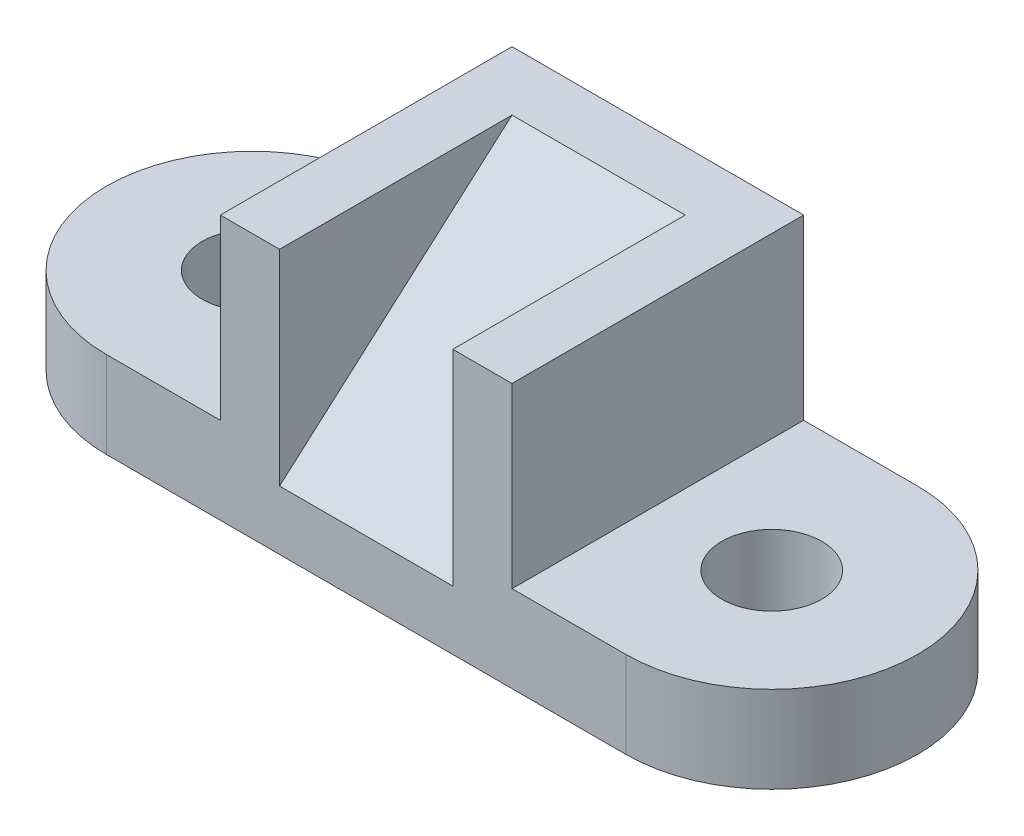
ISO-10303-21;
HEADER;
FILE_DESCRIPTION(('STEP AP214'),'2;1');
FILE_NAME('part.step','',(''),(''),'','','');
FILE_SCHEMA(('AUTOMOTIVE_DESIGN { 1 0 10303 214 1 1 1 1 }'));
ENDSEC;
DATA;
#1=APPLICATION_CONTEXT('core data for automotive mechanical design processes');
#2=APPLICATION_PROTOCOL_DEFINITION('international standard','automotive_design',2000,#1);
#3=PRODUCT_CONTEXT('',#1,'mechanical');
#4=PRODUCT('Part','Part','',(#3));
#5=PRODUCT_RELATED_PRODUCT_CATEGORY('part','',(#4));
#6=PRODUCT_DEFINITION_FORMATION('','',#4);
#7=PRODUCT_DEFINITION_CONTEXT('part definition',#1,'design');
#8=PRODUCT_DEFINITION('design','',#6,#7);
#9=PRODUCT_DEFINITION_SHAPE('','',#8);
#10=(LENGTH_UNIT() NAMED_UNIT(*) SI_UNIT(.MILLI.,.METRE.));
#11=(NAMED_UNIT(*) PLANE_ANGLE_UNIT() SI_UNIT($,.RADIAN.));
#12=(NAMED_UNIT(*) SI_UNIT($,.STERADIAN.) SOLID_ANGLE_UNIT());
#13=UNCERTAINTY_MEASURE_WITH_UNIT(LENGTH_MEASURE(1.E-05),#10,'distance_accuracy_value','');
#14=(GEOMETRIC_REPRESENTATION_CONTEXT(3) GLOBAL_UNCERTAINTY_ASSIGNED_CONTEXT((#13)) GLOBAL_UNIT_ASSIGNED_CONTEXT((#10,
#11,#12)) REPRESENTATION_CONTEXT('',''));
#15=CARTESIAN_POINT('',(0.,0.,0.));
#16=DIRECTION('',(0.,0.,1.));
#17=DIRECTION('',(1.,0.,0.));
#18=AXIS2_PLACEMENT_3D('',#15,#16,#17);
#19=CARTESIAN_POINT('',(0.,19.,0.));
#20=DIRECTION('',(0.,1.,0.));
#21=DIRECTION('',(0.,0.,1.));
#22=AXIS2_PLACEMENT_3D('',#19,#20,#21);
#23=PLANE('',#22);
#24=CARTESIAN_POINT('',(57.,19.,0.));
#25=DIRECTION('',(0.,1.,0.));
#26=DIRECTION('',(0.,0.,1.));
#27=AXIS2_PLACEMENT_3D('',#24,#25,#26);
#28=CIRCLE('',#27,11.);
#29=CARTESIAN_POINT('',(57.,19.,-11.));
#30=VERTEX_POINT('',#29);
#31=EDGE_CURVE('E150',#30,#30,#28,.F.);
#32=ORIENTED_EDGE('',*,*,#31,.T.);
#33=EDGE_LOOP('',(#32));
#34=FACE_BOUND('',#33,.T.);
#35=DIRECTION('',(-1.,0.,0.));
#36=VECTOR('',#35,1.);
#37=CARTESIAN_POINT('',(0.,19.,-32.));
#38=LINE('',#37,#36);
#39=CARTESIAN_POINT('',(57.,19.,-32.));
#40=VERTEX_POINT('',#39);
#41=CARTESIAN_POINT('',(32.,19.,-32.));
#42=VERTEX_POINT('',#41);
#43=EDGE_CURVE('E163',#40,#42,#38,.T.);
#44=ORIENTED_EDGE('',*,*,#43,.T.);
#45=DIRECTION('',(0.,0.,-1.));
#46=VECTOR('',#45,1.);
#47=CARTESIAN_POINT('',(32.,19.,-32.));
#48=LINE('',#47,#46);
#49=CARTESIAN_POINT('',(32.,19.,32.));
#50=VERTEX_POINT('',#49);
#51=EDGE_CURVE('E221',#50,#42,#48,.T.);
#52=ORIENTED_EDGE('',*,*,#51,.F.);
#53=DIRECTION('',(1.,0.,0.));
#54=VECTOR('',#53,1.);
#55=CARTESIAN_POINT('',(0.,19.,32.));
#56=LINE('',#55,#54);
#57=CARTESIAN_POINT('',(57.,19.,32.));
#58=VERTEX_POINT('',#57);
#59=EDGE_CURVE('E146',#50,#58,#56,.T.);
#60=ORIENTED_EDGE('',*,*,#59,.T.);
#61=CARTESIAN_POINT('',(57.,19.,0.));
#62=DIRECTION('',(0.,1.,0.));
#63=DIRECTION('',(0.,0.,1.));
#64=AXIS2_PLACEMENT_3D('',#61,#62,#63);
#65=CIRCLE('',#64,32.);
#66=EDGE_CURVE('E159',#58,#40,#65,.T.);
#67=ORIENTED_EDGE('',*,*,#66,.T.);
#68=EDGE_LOOP('',(#44,#52,#60,#67));
#69=FACE_BOUND('',#68,.T.);
#70=ADVANCED_FACE('F39',(#34,#69),#23,.T.);
#71=CARTESIAN_POINT('',(-57.,19.,0.));
#72=DIRECTION('',(0.,1.,0.));
#73=DIRECTION('',(0.,0.,1.));
#74=AXIS2_PLACEMENT_3D('',#71,#72,#73);
#75=CIRCLE('',#74,11.);
#76=CARTESIAN_POINT('',(-57.,19.,-11.));
#77=VERTEX_POINT('',#76);
#78=EDGE_CURVE('E147',#77,#77,#75,.F.);
#79=ORIENTED_EDGE('',*,*,#78,.T.);
#80=EDGE_LOOP('',(#79));
#81=FACE_BOUND('',#80,.T.);
#82=DIRECTION('',(1.,0.,0.));
#83=VECTOR('',#82,1.);
#84=CARTESIAN_POINT('',(0.,19.,32.));
#85=LINE('',#84,#83);
#86=CARTESIAN_POINT('',(-57.,19.,32.));
#87=VERTEX_POINT('',#86);
#88=CARTESIAN_POINT('',(-32.,19.,32.));
#89=VERTEX_POINT('',#88);
#90=EDGE_CURVE('E54',#87,#89,#85,.T.);
#91=ORIENTED_EDGE('',*,*,#90,.T.);
#92=DIRECTION('',(0.,0.,1.));
#93=VECTOR('',#92,1.);
#94=CARTESIAN_POINT('',(-32.,19.,-32.));
#95=LINE('',#94,#93);
#96=CARTESIAN_POINT('',(-32.,19.,-32.));
#97=VERTEX_POINT('',#96);
#98=EDGE_CURVE('E58',#97,#89,#95,.T.);
#99=ORIENTED_EDGE('',*,*,#98,.F.);
#100=CARTESIAN_POINT('',(-57.,19.,-32.));
#101=VERTEX_POINT('',#100);
#102=EDGE_CURVE('E162',#97,#101,#38,.T.);
#103=ORIENTED_EDGE('',*,*,#102,.T.);
#104=CARTESIAN_POINT('',(-57.,19.,0.));
#105=DIRECTION('',(0.,1.,0.));
#106=DIRECTION('',(0.,0.,1.));
#107=AXIS2_PLACEMENT_3D('',#104,#105,#106);
#108=CIRCLE('',#107,32.);
#109=EDGE_CURVE('E165',#101,#87,#108,.T.);
#110=ORIENTED_EDGE('',*,*,#109,.T.);
#111=EDGE_LOOP('',(#91,#99,#103,#110));
#112=FACE_BOUND('',#111,.T.);
#113=ADVANCED_FACE('F235',(#81,#112),#23,.T.);
#114=CARTESIAN_POINT('',(-57.,13.,32.));
#115=DIRECTION('',(0.,0.,-1.));
#116=DIRECTION('',(-1.,0.,0.));
#117=AXIS2_PLACEMENT_3D('',#114,#115,#116);
#118=PLANE('',#117);
#119=DIRECTION('',(1.,0.,0.));
#120=VECTOR('',#119,1.);
#121=CARTESIAN_POINT('',(-313.810533540325,13.,32.));
#122=LINE('',#121,#120);
#123=CARTESIAN_POINT('',(-19.,13.,32.));
#124=VERTEX_POINT('',#123);
#125=CARTESIAN_POINT('',(19.,13.,32.));
#126=VERTEX_POINT('',#125);
#127=EDGE_CURVE('E173',#124,#126,#122,.T.);
#128=ORIENTED_EDGE('',*,*,#127,.F.);
#129=DIRECTION('',(0.,-1.,0.));
#130=VECTOR('',#129,1.);
#131=CARTESIAN_POINT('',(-19.,19.,32.));
#132=LINE('',#131,#130);
#133=CARTESIAN_POINT('',(-19.,58.,32.));
#134=VERTEX_POINT('',#133);
#135=EDGE_CURVE('E168',#134,#124,#132,.T.);
#136=ORIENTED_EDGE('',*,*,#135,.F.);
#137=DIRECTION('',(1.,0.,0.));
#138=VECTOR('',#137,1.);
#139=CARTESIAN_POINT('',(-32.,58.,32.));
#140=LINE('',#139,#138);
#141=CARTESIAN_POINT('',(-32.,58.,32.));
#142=VERTEX_POINT('',#141);
#143=EDGE_CURVE('E443',#142,#134,#140,.T.);
#144=ORIENTED_EDGE('',*,*,#143,.F.);
#145=DIRECTION('',(0.,-1.,0.));
#146=VECTOR('',#145,1.);
#147=CARTESIAN_POINT('',(-32.,58.,32.));
#148=LINE('',#147,#146);
#149=EDGE_CURVE('E227',#142,#89,#148,.T.);
#150=ORIENTED_EDGE('',*,*,#149,.T.);
#151=ORIENTED_EDGE('',*,*,#90,.F.);
#152=DIRECTION('',(0.,-1.,0.));
#153=VECTOR('',#152,1.);
#154=CARTESIAN_POINT('',(-57.,13.,32.));
#155=LINE('',#154,#153);
#156=CARTESIAN_POINT('',(-57.,0.,32.));
#157=VERTEX_POINT('',#156);
#158=EDGE_CURVE('E47',#87,#157,#155,.T.);
#159=ORIENTED_EDGE('',*,*,#158,.T.);
#160=DIRECTION('',(1.,0.,0.));
#161=VECTOR('',#160,1.);
#162=CARTESIAN_POINT('',(-57.,0.,32.));
#163=LINE('',#162,#161);
#164=CARTESIAN_POINT('',(57.,0.,32.));
#165=VERTEX_POINT('',#164);
#166=EDGE_CURVE('E189',#157,#165,#163,.T.);
#167=ORIENTED_EDGE('',*,*,#166,.T.);
#168=DIRECTION('',(0.,-1.,0.));
#169=VECTOR('',#168,1.);
#170=CARTESIAN_POINT('',(57.,13.,32.));
#171=LINE('',#170,#169);
#172=EDGE_CURVE('E201',#58,#165,#171,.T.);
#173=ORIENTED_EDGE('',*,*,#172,.F.);
#174=ORIENTED_EDGE('',*,*,#59,.F.);
#175=DIRECTION('',(0.,-1.,0.));
#176=VECTOR('',#175,1.);
#177=CARTESIAN_POINT('',(32.,58.,32.));
#178=LINE('',#177,#176);
#179=CARTESIAN_POINT('',(32.,58.,32.));
#180=VERTEX_POINT('',#179);
#181=EDGE_CURVE('E125',#180,#50,#178,.T.);
#182=ORIENTED_EDGE('',*,*,#181,.F.);
#183=DIRECTION('',(1.,0.,0.));
#184=VECTOR('',#183,1.);
#185=CARTESIAN_POINT('',(19.,58.,32.));
#186=LINE('',#185,#184);
#187=CARTESIAN_POINT('',(19.,58.,32.));
#188=VERTEX_POINT('',#187);
#189=EDGE_CURVE('E131',#188,#180,#186,.T.);
#190=ORIENTED_EDGE('',*,*,#189,.F.);
#191=DIRECTION('',(0.,-1.,0.));
#192=VECTOR('',#191,1.);
#193=CARTESIAN_POINT('',(19.,19.,32.));
#194=LINE('',#193,#192);
#195=EDGE_CURVE('E171',#188,#126,#194,.T.);
#196=ORIENTED_EDGE('',*,*,#195,.T.);
#197=EDGE_LOOP('',(#128,#136,#144,#150,#151,#159,#167,#173,#174,#182,#190,#196));
#198=FACE_BOUND('',#197,.T.);
#199=ADVANCED_FACE('F144',(#198),#118,.F.);
#200=CARTESIAN_POINT('',(-57.,0.,0.));
#201=DIRECTION('',(0.,1.,0.));
#202=DIRECTION('',(0.,0.,1.));
#203=AXIS2_PLACEMENT_3D('',#200,#201,#202);
#204=PLANE('',#203);
#205=CARTESIAN_POINT('',(-57.,0.,0.));
#206=DIRECTION('',(0.,1.,0.));
#207=DIRECTION('',(0.,0.,1.));
#208=AXIS2_PLACEMENT_3D('',#205,#206,#207);
#209=CIRCLE('',#208,32.);
#210=CARTESIAN_POINT('',(-57.,0.,-32.));
#211=VERTEX_POINT('',#210);
#212=EDGE_CURVE('E186',#211,#157,#209,.T.);
#213=ORIENTED_EDGE('',*,*,#212,.F.);
#214=DIRECTION('',(-1.,0.,0.));
#215=VECTOR('',#214,1.);
#216=CARTESIAN_POINT('',(-57.,0.,-32.));
#217=LINE('',#216,#215);
#218=CARTESIAN_POINT('',(57.,0.,-32.));
#219=VERTEX_POINT('',#218);
#220=EDGE_CURVE('E193',#219,#211,#217,.T.);
#221=ORIENTED_EDGE('',*,*,#220,.F.);
#222=CARTESIAN_POINT('',(57.,0.,0.));
#223=DIRECTION('',(0.,1.,0.));
#224=DIRECTION('',(0.,0.,1.));
#225=AXIS2_PLACEMENT_3D('',#222,#223,#224);
#226=CIRCLE('',#225,32.);
#227=EDGE_CURVE('E191',#165,#219,#226,.T.);
#228=ORIENTED_EDGE('',*,*,#227,.F.);
#229=ORIENTED_EDGE('',*,*,#166,.F.);
#230=EDGE_LOOP('',(#213,#221,#228,#229));
#231=FACE_BOUND('',#230,.T.);
#232=CARTESIAN_POINT('',(-57.,0.,0.));
#233=DIRECTION('',(0.,1.,0.));
#234=DIRECTION('',(0.,0.,1.));
#235=AXIS2_PLACEMENT_3D('',#232,#233,#234);
#236=CIRCLE('',#235,11.);
#237=CARTESIAN_POINT('',(-57.,0.,-11.));
#238=VERTEX_POINT('',#237);
#239=EDGE_CURVE('E183',#238,#238,#236,.T.);
#240=ORIENTED_EDGE('',*,*,#239,.T.);
#241=EDGE_LOOP('',(#240));
#242=FACE_BOUND('',#241,.T.);
#243=CARTESIAN_POINT('',(57.,0.,0.));
#244=DIRECTION('',(0.,1.,0.));
#245=DIRECTION('',(0.,0.,1.));
#246=AXIS2_PLACEMENT_3D('',#243,#244,#245);
#247=CIRCLE('',#246,11.);
#248=CARTESIAN_POINT('',(57.,0.,-11.));
#249=VERTEX_POINT('',#248);
#250=EDGE_CURVE('E180',#249,#249,#247,.T.);
#251=ORIENTED_EDGE('',*,*,#250,.T.);
#252=EDGE_LOOP('',(#251));
#253=FACE_BOUND('',#252,.T.);
#254=ADVANCED_FACE('F211',(#231,#242,#253),#204,.F.);
#255=CARTESIAN_POINT('',(-57.,13.,0.));
#256=DIRECTION('',(0.,-1.,0.));
#257=DIRECTION('',(0.,0.,-1.));
#258=AXIS2_PLACEMENT_3D('',#255,#256,#257);
#259=CYLINDRICAL_SURFACE('',#258,32.);
#260=ORIENTED_EDGE('',*,*,#212,.T.);
#261=ORIENTED_EDGE('',*,*,#158,.F.);
#262=ORIENTED_EDGE('',*,*,#109,.F.);
#263=DIRECTION('',(0.,-1.,0.));
#264=VECTOR('',#263,1.);
#265=CARTESIAN_POINT('',(-57.,13.,-32.));
#266=LINE('',#265,#264);
#267=EDGE_CURVE('E195',#101,#211,#266,.T.);
#268=ORIENTED_EDGE('',*,*,#267,.T.);
#269=EDGE_LOOP('',(#260,#261,#262,#268));
#270=FACE_BOUND('',#269,.T.);
#271=ADVANCED_FACE('F41',(#270),#259,.T.);
#272=CARTESIAN_POINT('',(57.,13.,0.));
#273=DIRECTION('',(0.,-1.,0.));
#274=DIRECTION('',(0.,0.,-1.));
#275=AXIS2_PLACEMENT_3D('',#272,#273,#274);
#276=CYLINDRICAL_SURFACE('',#275,32.);
#277=ORIENTED_EDGE('',*,*,#227,.T.);
#278=DIRECTION('',(0.,-1.,0.));
#279=VECTOR('',#278,1.);
#280=CARTESIAN_POINT('',(57.,13.,-32.));
#281=LINE('',#280,#279);
#282=EDGE_CURVE('E198',#40,#219,#281,.T.);
#283=ORIENTED_EDGE('',*,*,#282,.F.);
#284=ORIENTED_EDGE('',*,*,#66,.F.);
#285=ORIENTED_EDGE('',*,*,#172,.T.);
#286=EDGE_LOOP('',(#277,#283,#284,#285));
#287=FACE_BOUND('',#286,.T.);
#288=ADVANCED_FACE('F215',(#287),#276,.T.);
#289=CARTESIAN_POINT('',(-57.,13.,-32.));
#290=DIRECTION('',(0.,0.,1.));
#291=DIRECTION('',(1.,0.,0.));
#292=AXIS2_PLACEMENT_3D('',#289,#290,#291);
#293=PLANE('',#292);
#294=ORIENTED_EDGE('',*,*,#220,.T.);
#295=ORIENTED_EDGE('',*,*,#267,.F.);
#296=ORIENTED_EDGE('',*,*,#102,.F.);
#297=DIRECTION('',(0.,-1.,0.));
#298=VECTOR('',#297,1.);
#299=CARTESIAN_POINT('',(-32.,58.,-32.));
#300=LINE('',#299,#298);
#301=CARTESIAN_POINT('',(-32.,58.,-32.));
#302=VERTEX_POINT('',#301);
#303=EDGE_CURVE('E152',#302,#97,#300,.T.);
#304=ORIENTED_EDGE('',*,*,#303,.F.);
#305=DIRECTION('',(-1.,0.,0.));
#306=VECTOR('',#305,1.);
#307=CARTESIAN_POINT('',(-32.,58.,-32.));
#308=LINE('',#307,#306);
#309=CARTESIAN_POINT('',(32.,58.,-32.));
#310=VERTEX_POINT('',#309);
#311=EDGE_CURVE('E130',#310,#302,#308,.T.);
#312=ORIENTED_EDGE('',*,*,#311,.F.);
#313=DIRECTION('',(0.,-1.,0.));
#314=VECTOR('',#313,1.);
#315=CARTESIAN_POINT('',(32.,58.,-32.));
#316=LINE('',#315,#314);
#317=EDGE_CURVE('E127',#310,#42,#316,.T.);
#318=ORIENTED_EDGE('',*,*,#317,.T.);
#319=ORIENTED_EDGE('',*,*,#43,.F.);
#320=ORIENTED_EDGE('',*,*,#282,.T.);
#321=EDGE_LOOP('',(#294,#295,#296,#304,#312,#318,#319,#320));
#322=FACE_BOUND('',#321,.T.);
#323=ADVANCED_FACE('F219',(#322),#293,.F.);
#324=CARTESIAN_POINT('',(-57.,13.,0.));
#325=DIRECTION('',(0.,-1.,0.));
#326=DIRECTION('',(0.,0.,-1.));
#327=AXIS2_PLACEMENT_3D('',#324,#325,#326);
#328=CYLINDRICAL_SURFACE('',#327,11.);
#329=CARTESIAN_POINT('',(-57.,0.,-11.));
#330=CARTESIAN_POINT('',(-57.,0.197916666666667,-11.));
#331=CARTESIAN_POINT('',(-57.,0.395833333333334,-11.));
#332=CARTESIAN_POINT('',(-57.,0.791666666666667,-11.));
#333=CARTESIAN_POINT('',(-57.,0.989583333333334,-11.));
#334=CARTESIAN_POINT('',(-57.,1.38541666666667,-11.));
#335=CARTESIAN_POINT('',(-57.,1.58333333333333,-11.));
#336=CARTESIAN_POINT('',(-57.,1.97916666666667,-11.));
#337=CARTESIAN_POINT('',(-57.,2.17708333333333,-11.));
#338=CARTESIAN_POINT('',(-57.,2.57291666666667,-11.));
#339=CARTESIAN_POINT('',(-57.,2.77083333333333,-11.));
#340=CARTESIAN_POINT('',(-57.,3.16666666666667,-11.));
#341=CARTESIAN_POINT('',(-57.,3.36458333333333,-11.));
#342=CARTESIAN_POINT('',(-57.,3.76041666666667,-11.));
#343=CARTESIAN_POINT('',(-57.,3.95833333333333,-11.));
#344=CARTESIAN_POINT('',(-57.,4.35416666666667,-11.));
#345=CARTESIAN_POINT('',(-57.,4.55208333333333,-11.));
#346=CARTESIAN_POINT('',(-57.,4.94791666666667,-11.));
#347=CARTESIAN_POINT('',(-57.,5.14583333333333,-11.));
#348=CARTESIAN_POINT('',(-57.,5.54166666666667,-11.));
#349=CARTESIAN_POINT('',(-57.,5.73958333333333,-11.));
#350=CARTESIAN_POINT('',(-57.,6.13541666666667,-11.));
#351=CARTESIAN_POINT('',(-57.,6.33333333333333,-11.));
#352=CARTESIAN_POINT('',(-57.,6.72916666666667,-11.));
#353=CARTESIAN_POINT('',(-57.,6.92708333333333,-11.));
#354=CARTESIAN_POINT('',(-57.,7.32291666666667,-11.));
#355=CARTESIAN_POINT('',(-57.,7.52083333333333,-11.));
#356=CARTESIAN_POINT('',(-57.,7.91666666666667,-11.));
#357=CARTESIAN_POINT('',(-57.,8.11458333333333,-11.));
#358=CARTESIAN_POINT('',(-57.,8.51041666666667,-11.));
#359=CARTESIAN_POINT('',(-57.,8.70833333333333,-11.));
#360=CARTESIAN_POINT('',(-57.,9.10416666666667,-11.));
#361=CARTESIAN_POINT('',(-57.,9.30208333333333,-11.));
#362=CARTESIAN_POINT('',(-57.,9.69791666666667,-11.));
#363=CARTESIAN_POINT('',(-57.,9.89583333333333,-11.));
#364=CARTESIAN_POINT('',(-57.,10.2916666666667,-11.));
#365=CARTESIAN_POINT('',(-57.,10.4895833333333,-11.));
#366=CARTESIAN_POINT('',(-57.,10.8854166666667,-11.));
#367=CARTESIAN_POINT('',(-57.,11.0833333333333,-11.));
#368=CARTESIAN_POINT('',(-57.,11.4791666666667,-11.));
#369=CARTESIAN_POINT('',(-57.,11.6770833333333,-11.));
#370=CARTESIAN_POINT('',(-57.,12.0729166666667,-11.));
#371=CARTESIAN_POINT('',(-57.,12.2708333333333,-11.));
#372=CARTESIAN_POINT('',(-57.,12.6666666666667,-11.));
#373=CARTESIAN_POINT('',(-57.,12.8645833333333,-11.));
#374=CARTESIAN_POINT('',(-57.,13.2604166666667,-11.));
#375=CARTESIAN_POINT('',(-57.,13.4583333333333,-11.));
#376=CARTESIAN_POINT('',(-57.,13.8541666666667,-11.));
#377=CARTESIAN_POINT('',(-57.,14.0520833333333,-11.));
#378=CARTESIAN_POINT('',(-57.,14.4479166666667,-11.));
#379=CARTESIAN_POINT('',(-57.,14.6458333333333,-11.));
#380=CARTESIAN_POINT('',(-57.,15.0416666666667,-11.));
#381=CARTESIAN_POINT('',(-57.,15.2395833333333,-11.));
#382=CARTESIAN_POINT('',(-57.,15.6354166666667,-11.));
#383=CARTESIAN_POINT('',(-57.,15.8333333333333,-11.));
#384=CARTESIAN_POINT('',(-57.,16.2291666666667,-11.));
#385=CARTESIAN_POINT('',(-57.,16.4270833333333,-11.));
#386=CARTESIAN_POINT('',(-57.,16.8229166666667,-11.));
#387=CARTESIAN_POINT('',(-57.,17.0208333333333,-11.));
#388=CARTESIAN_POINT('',(-57.,17.4166666666667,-11.));
#389=CARTESIAN_POINT('',(-57.,17.6145833333333,-11.));
#390=CARTESIAN_POINT('',(-57.,18.0104166666667,-11.));
#391=CARTESIAN_POINT('',(-57.,18.2083333333333,-11.));
#392=CARTESIAN_POINT('',(-57.,18.6041666666667,-11.));
#393=CARTESIAN_POINT('',(-57.,18.8020833333333,-11.));
#394=CARTESIAN_POINT('',(-57.,19.,-11.));
#395=B_SPLINE_CURVE_WITH_KNOTS('',3,(#329,#330,#331,#332,#333,#334,#335,#336,#337,#338,#339,
#340,#341,#342,#343,#344,#345,#346,#347,#348,#349,#350,#351,#352,#353,#354,#355,#356,#357,#358,
#359,#360,#361,#362,#363,#364,#365,#366,#367,#368,#369,#370,#371,#372,#373,#374,#375,#376,#377,
#378,#379,#380,#381,#382,#383,#384,#385,#386,#387,#388,#389,#390,#391,#392,#393,#394),
.UNSPECIFIED.,.F.,.F.,(4,2,2,2,2,2,2,2,2,2,2,2,2,2,2,2,2,2,2,2,2,2,2,2,2,2,2,2,2,2,2,2,4),(0.,
0.593750000000001,1.1875,1.78125,2.375,2.96875,3.5625,4.15625,4.75,5.34375,5.9375,6.53125,7.125,
7.71875,8.3125,8.90625,9.5,10.09375,10.6875,11.28125,11.875,12.46875,13.0625,13.65625,14.25,
14.84375,15.4375,16.03125,16.625,17.21875,17.8125,18.40625,19.),.UNSPECIFIED.);
#396=EDGE_CURVE('BSEAM262',#238,#77,#395,.T.);
#397=ORIENTED_EDGE('',*,*,#239,.F.);
#398=ORIENTED_EDGE('',*,*,#78,.F.);
#399=ORIENTED_EDGE('',*,*,#396,.T.);
#400=ORIENTED_EDGE('',*,*,#396,.F.);
#401=EDGE_LOOP('',(#397,#399,#398,#400));
#402=FACE_BOUND('',#401,.T.);
#403=ADVANCED_FACE('F262',(#402),#328,.F.);
#404=CARTESIAN_POINT('',(57.,13.,0.));
#405=DIRECTION('',(0.,-1.,0.));
#406=DIRECTION('',(0.,0.,-1.));
#407=AXIS2_PLACEMENT_3D('',#404,#405,#406);
#408=CYLINDRICAL_SURFACE('',#407,11.);
#409=CARTESIAN_POINT('',(57.,0.,-11.));
#410=CARTESIAN_POINT('',(57.,0.197916666666667,-11.));
#411=CARTESIAN_POINT('',(57.,0.395833333333334,-11.));
#412=CARTESIAN_POINT('',(57.,0.791666666666667,-11.));
#413=CARTESIAN_POINT('',(57.,0.989583333333334,-11.));
#414=CARTESIAN_POINT('',(57.,1.38541666666667,-11.));
#415=CARTESIAN_POINT('',(57.,1.58333333333333,-11.));
#416=CARTESIAN_POINT('',(57.,1.97916666666667,-11.));
#417=CARTESIAN_POINT('',(57.,2.17708333333333,-11.));
#418=CARTESIAN_POINT('',(57.,2.57291666666667,-11.));
#419=CARTESIAN_POINT('',(57.,2.77083333333333,-11.));
#420=CARTESIAN_POINT('',(57.,3.16666666666667,-11.));
#421=CARTESIAN_POINT('',(57.,3.36458333333333,-11.));
#422=CARTESIAN_POINT('',(57.,3.76041666666667,-11.));
#423=CARTESIAN_POINT('',(57.,3.95833333333333,-11.));
#424=CARTESIAN_POINT('',(57.,4.35416666666667,-11.));
#425=CARTESIAN_POINT('',(57.,4.55208333333333,-11.));
#426=CARTESIAN_POINT('',(57.,4.94791666666667,-11.));
#427=CARTESIAN_POINT('',(57.,5.14583333333333,-11.));
#428=CARTESIAN_POINT('',(57.,5.54166666666667,-11.));
#429=CARTESIAN_POINT('',(57.,5.73958333333333,-11.));
#430=CARTESIAN_POINT('',(57.,6.13541666666667,-11.));
#431=CARTESIAN_POINT('',(57.,6.33333333333333,-11.));
#432=CARTESIAN_POINT('',(57.,6.72916666666667,-11.));
#433=CARTESIAN_POINT('',(57.,6.92708333333333,-11.));
#434=CARTESIAN_POINT('',(57.,7.32291666666667,-11.));
#435=CARTESIAN_POINT('',(57.,7.52083333333333,-11.));
#436=CARTESIAN_POINT('',(57.,7.91666666666667,-11.));
#437=CARTESIAN_POINT('',(57.,8.11458333333333,-11.));
#438=CARTESIAN_POINT('',(57.,8.51041666666667,-11.));
#439=CARTESIAN_POINT('',(57.,8.70833333333333,-11.));
#440=CARTESIAN_POINT('',(57.,9.10416666666667,-11.));
#441=CARTESIAN_POINT('',(57.,9.30208333333333,-11.));
#442=CARTESIAN_POINT('',(57.,9.69791666666667,-11.));
#443=CARTESIAN_POINT('',(57.,9.89583333333333,-11.));
#444=CARTESIAN_POINT('',(57.,10.2916666666667,-11.));
#445=CARTESIAN_POINT('',(57.,10.4895833333333,-11.));
#446=CARTESIAN_POINT('',(57.,10.8854166666667,-11.));
#447=CARTESIAN_POINT('',(57.,11.0833333333333,-11.));
#448=CARTESIAN_POINT('',(57.,11.4791666666667,-11.));
#449=CARTESIAN_POINT('',(57.,11.6770833333333,-11.));
#450=CARTESIAN_POINT('',(57.,12.0729166666667,-11.));
#451=CARTESIAN_POINT('',(57.,12.2708333333333,-11.));
#452=CARTESIAN_POINT('',(57.,12.6666666666667,-11.));
#453=CARTESIAN_POINT('',(57.,12.8645833333333,-11.));
#454=CARTESIAN_POINT('',(57.,13.2604166666667,-11.));
#455=CARTESIAN_POINT('',(57.,13.4583333333333,-11.));
#456=CARTESIAN_POINT('',(57.,13.8541666666667,-11.));
#457=CARTESIAN_POINT('',(57.,14.0520833333333,-11.));
#458=CARTESIAN_POINT('',(57.,14.4479166666667,-11.));
#459=CARTESIAN_POINT('',(57.,14.6458333333333,-11.));
#460=CARTESIAN_POINT('',(57.,15.0416666666667,-11.));
#461=CARTESIAN_POINT('',(57.,15.2395833333333,-11.));
#462=CARTESIAN_POINT('',(57.,15.6354166666667,-11.));
#463=CARTESIAN_POINT('',(57.,15.8333333333333,-11.));
#464=CARTESIAN_POINT('',(57.,16.2291666666667,-11.));
#465=CARTESIAN_POINT('',(57.,16.4270833333333,-11.));
#466=CARTESIAN_POINT('',(57.,16.8229166666667,-11.));
#467=CARTESIAN_POINT('',(57.,17.0208333333333,-11.));
#468=CARTESIAN_POINT('',(57.,17.4166666666667,-11.));
#469=CARTESIAN_POINT('',(57.,17.6145833333333,-11.));
#470=CARTESIAN_POINT('',(57.,18.0104166666667,-11.));
#471=CARTESIAN_POINT('',(57.,18.2083333333333,-11.));
#472=CARTESIAN_POINT('',(57.,18.6041666666667,-11.));
#473=CARTESIAN_POINT('',(57.,18.8020833333333,-11.));
#474=CARTESIAN_POINT('',(57.,19.,-11.));
#475=B_SPLINE_CURVE_WITH_KNOTS('',3,(#409,#410,#411,#412,#413,#414,#415,#416,#417,#418,#419,
#420,#421,#422,#423,#424,#425,#426,#427,#428,#429,#430,#431,#432,#433,#434,#435,#436,#437,#438,
#439,#440,#441,#442,#443,#444,#445,#446,#447,#448,#449,#450,#451,#452,#453,#454,#455,#456,#457,
#458,#459,#460,#461,#462,#463,#464,#465,#466,#467,#468,#469,#470,#471,#472,#473,#474),
.UNSPECIFIED.,.F.,.F.,(4,2,2,2,2,2,2,2,2,2,2,2,2,2,2,2,2,2,2,2,2,2,2,2,2,2,2,2,2,2,2,2,4),(0.,
0.593750000000001,1.1875,1.78125,2.375,2.96875,3.5625,4.15625,4.75,5.34375,5.9375,6.53125,7.125,
7.71875,8.3125,8.90625,9.5,10.09375,10.6875,11.28125,11.875,12.46875,13.0625,13.65625,14.25,
14.84375,15.4375,16.03125,16.625,17.21875,17.8125,18.40625,19.),.UNSPECIFIED.);
#476=EDGE_CURVE('BSEAM258',#249,#30,#475,.T.);
#477=ORIENTED_EDGE('',*,*,#250,.F.);
#478=ORIENTED_EDGE('',*,*,#31,.F.);
#479=ORIENTED_EDGE('',*,*,#476,.T.);
#480=ORIENTED_EDGE('',*,*,#476,.F.);
#481=EDGE_LOOP('',(#477,#479,#478,#480));
#482=FACE_BOUND('',#481,.T.);
#483=ADVANCED_FACE('F258',(#482),#408,.F.);
#484=CARTESIAN_POINT('',(-313.810533540325,58.,-19.));
#485=DIRECTION('',(0.,0.749837855365093,0.661621637086846));
#486=DIRECTION('',(0.,-0.661621637086846,0.749837855365093));
#487=AXIS2_PLACEMENT_3D('',#484,#485,#486);
#488=PLANE('',#487);
#489=ORIENTED_EDGE('',*,*,#127,.T.);
#490=DIRECTION('',(0.,0.661621637086846,-0.749837855365093));
#491=VECTOR('',#490,1.);
#492=CARTESIAN_POINT('',(19.,58.,-19.));
#493=LINE('',#492,#491);
#494=CARTESIAN_POINT('',(19.,58.,-19.));
#495=VERTEX_POINT('',#494);
#496=EDGE_CURVE('E176',#126,#495,#493,.T.);
#497=ORIENTED_EDGE('',*,*,#496,.T.);
#498=DIRECTION('',(-1.,0.,0.));
#499=VECTOR('',#498,1.);
#500=CARTESIAN_POINT('',(-19.,58.,-19.));
#501=LINE('',#500,#499);
#502=CARTESIAN_POINT('',(-19.,58.,-19.));
#503=VERTEX_POINT('',#502);
#504=EDGE_CURVE('E178',#495,#503,#501,.T.);
#505=ORIENTED_EDGE('',*,*,#504,.T.);
#506=DIRECTION('',(0.,-0.661621637086846,0.749837855365093));
#507=VECTOR('',#506,1.);
#508=CARTESIAN_POINT('',(-19.,58.,-19.));
#509=LINE('',#508,#507);
#510=EDGE_CURVE('E11',#503,#124,#509,.T.);
#511=ORIENTED_EDGE('',*,*,#510,.T.);
#512=EDGE_LOOP('',(#489,#497,#505,#511));
#513=FACE_BOUND('',#512,.T.);
#514=ADVANCED_FACE('F254',(#513),#488,.T.);
#515=CARTESIAN_POINT('',(19.,19.,0.));
#516=DIRECTION('',(1.,0.,0.));
#517=DIRECTION('',(0.,0.,-1.));
#518=AXIS2_PLACEMENT_3D('',#515,#516,#517);
#519=PLANE('',#518);
#520=ORIENTED_EDGE('',*,*,#496,.F.);
#521=ORIENTED_EDGE('',*,*,#195,.F.);
#522=DIRECTION('',(0.,0.,1.));
#523=VECTOR('',#522,1.);
#524=CARTESIAN_POINT('',(19.,58.,-19.));
#525=LINE('',#524,#523);
#526=EDGE_CURVE('E138',#495,#188,#525,.T.);
#527=ORIENTED_EDGE('',*,*,#526,.F.);
#528=EDGE_LOOP('',(#520,#521,#527));
#529=FACE_BOUND('',#528,.T.);
#530=ADVANCED_FACE('F250',(#529),#519,.F.);
#531=CARTESIAN_POINT('',(-19.,19.,0.));
#532=DIRECTION('',(-1.,0.,0.));
#533=DIRECTION('',(0.,0.,1.));
#534=AXIS2_PLACEMENT_3D('',#531,#532,#533);
#535=PLANE('',#534);
#536=ORIENTED_EDGE('',*,*,#135,.T.);
#537=ORIENTED_EDGE('',*,*,#510,.F.);
#538=DIRECTION('',(0.,0.,-1.));
#539=VECTOR('',#538,1.);
#540=CARTESIAN_POINT('',(-19.,58.,25.2));
#541=LINE('',#540,#539);
#542=EDGE_CURVE('E441',#134,#503,#541,.T.);
#543=ORIENTED_EDGE('',*,*,#542,.F.);
#544=EDGE_LOOP('',(#536,#537,#543));
#545=FACE_BOUND('',#544,.T.);
#546=ADVANCED_FACE('F247',(#545),#535,.F.);
#547=CARTESIAN_POINT('',(32.,58.,-32.));
#548=DIRECTION('',(-1.,0.,0.));
#549=DIRECTION('',(0.,0.,1.));
#550=AXIS2_PLACEMENT_3D('',#547,#548,#549);
#551=PLANE('',#550);
#552=ORIENTED_EDGE('',*,*,#51,.T.);
#553=ORIENTED_EDGE('',*,*,#317,.F.);
#554=DIRECTION('',(0.,0.,-1.));
#555=VECTOR('',#554,1.);
#556=CARTESIAN_POINT('',(32.,58.,-32.));
#557=LINE('',#556,#555);
#558=EDGE_CURVE('E120',#180,#310,#557,.T.);
#559=ORIENTED_EDGE('',*,*,#558,.F.);
#560=ORIENTED_EDGE('',*,*,#181,.T.);
#561=EDGE_LOOP('',(#552,#553,#559,#560));
#562=FACE_BOUND('',#561,.T.);
#563=ADVANCED_FACE('F123',(#562),#551,.F.);
#564=CARTESIAN_POINT('',(-32.,58.,-32.));
#565=DIRECTION('',(1.,0.,0.));
#566=DIRECTION('',(0.,0.,-1.));
#567=AXIS2_PLACEMENT_3D('',#564,#565,#566);
#568=PLANE('',#567);
#569=ORIENTED_EDGE('',*,*,#98,.T.);
#570=ORIENTED_EDGE('',*,*,#149,.F.);
#571=DIRECTION('',(0.,0.,1.));
#572=VECTOR('',#571,1.);
#573=CARTESIAN_POINT('',(-32.,58.,-32.));
#574=LINE('',#573,#572);
#575=EDGE_CURVE('E234',#302,#142,#574,.T.);
#576=ORIENTED_EDGE('',*,*,#575,.F.);
#577=ORIENTED_EDGE('',*,*,#303,.T.);
#578=EDGE_LOOP('',(#569,#570,#576,#577));
#579=FACE_BOUND('',#578,.T.);
#580=ADVANCED_FACE('F232',(#579),#568,.F.);
#581=CARTESIAN_POINT('',(0.,58.,0.));
#582=DIRECTION('',(0.,-1.,0.));
#583=DIRECTION('',(0.,0.,-1.));
#584=AXIS2_PLACEMENT_3D('',#581,#582,#583);
#585=PLANE('',#584);
#586=ORIENTED_EDGE('',*,*,#189,.T.);
#587=ORIENTED_EDGE('',*,*,#558,.T.);
#588=ORIENTED_EDGE('',*,*,#311,.T.);
#589=ORIENTED_EDGE('',*,*,#575,.T.);
#590=ORIENTED_EDGE('',*,*,#143,.T.);
#591=ORIENTED_EDGE('',*,*,#542,.T.);
#592=ORIENTED_EDGE('',*,*,#504,.F.);
#593=ORIENTED_EDGE('',*,*,#526,.T.);
#594=EDGE_LOOP('',(#586,#587,#588,#589,#590,#591,#592,#593));
#595=FACE_BOUND('',#594,.T.);
#596=ADVANCED_FACE('F135',(#595),#585,.F.);
#597=CLOSED_SHELL('',(#70,#113,#199,#254,#271,#288,#323,#403,#483,#514,#530,#546,#563,#580,#596));
#598=MANIFOLD_SOLID_BREP('B2',#597);
#599=ADVANCED_BREP_SHAPE_REPRESENTATION('',(#18,#598),#14);
#600=SHAPE_DEFINITION_REPRESENTATION(#9,#599);
ENDSEC;
END-ISO-10303-21;
